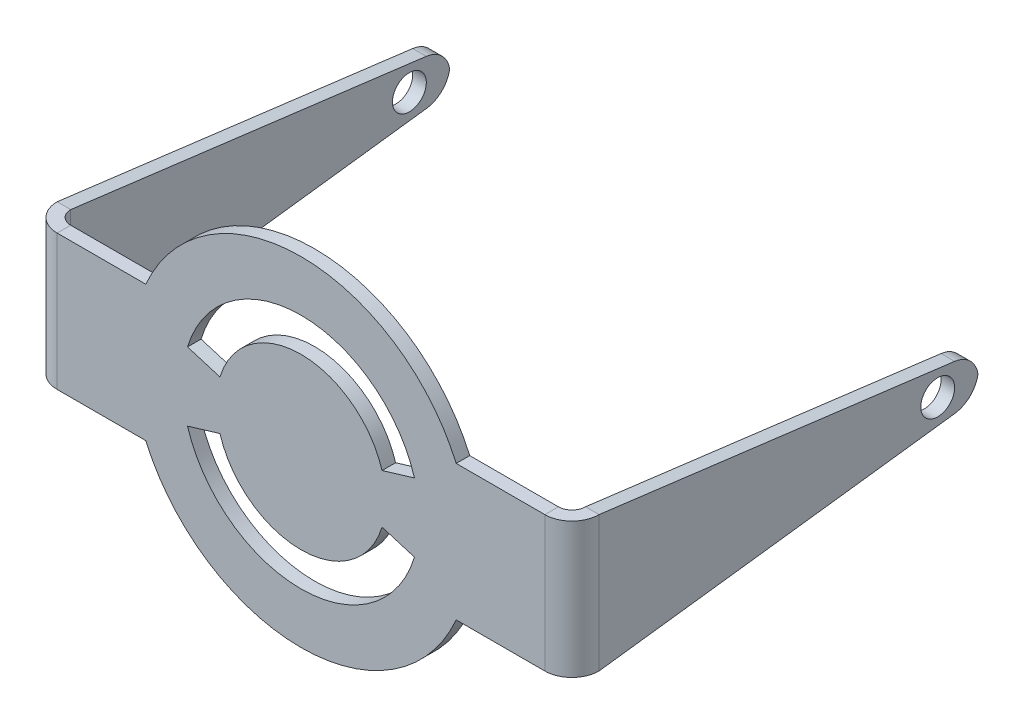
ISO-10303-21;
HEADER;
FILE_DESCRIPTION(('STEP AP214'),'2;1');
FILE_NAME('part.step','',(''),(''),'','','');
FILE_SCHEMA(('AUTOMOTIVE_DESIGN { 1 0 10303 214 1 1 1 1 }'));
ENDSEC;
DATA;
#1=APPLICATION_CONTEXT('core data for automotive mechanical design processes');
#2=APPLICATION_PROTOCOL_DEFINITION('international standard','automotive_design',2000,#1);
#3=PRODUCT_CONTEXT('',#1,'mechanical');
#4=PRODUCT('Part','Part','',(#3));
#5=PRODUCT_RELATED_PRODUCT_CATEGORY('part','',(#4));
#6=PRODUCT_DEFINITION_FORMATION('','',#4);
#7=PRODUCT_DEFINITION_CONTEXT('part definition',#1,'design');
#8=PRODUCT_DEFINITION('design','',#6,#7);
#9=PRODUCT_DEFINITION_SHAPE('','',#8);
#10=(LENGTH_UNIT() NAMED_UNIT(*) SI_UNIT(.MILLI.,.METRE.));
#11=(NAMED_UNIT(*) PLANE_ANGLE_UNIT() SI_UNIT($,.RADIAN.));
#12=(NAMED_UNIT(*) SI_UNIT($,.STERADIAN.) SOLID_ANGLE_UNIT());
#13=UNCERTAINTY_MEASURE_WITH_UNIT(LENGTH_MEASURE(1.E-05),#10,'distance_accuracy_value','');
#14=(GEOMETRIC_REPRESENTATION_CONTEXT(3) GLOBAL_UNCERTAINTY_ASSIGNED_CONTEXT((#13)) GLOBAL_UNIT_ASSIGNED_CONTEXT((#10,
#11,#12)) REPRESENTATION_CONTEXT('',''));
#15=CARTESIAN_POINT('',(0.,0.,0.));
#16=DIRECTION('',(0.,0.,1.));
#17=DIRECTION('',(1.,0.,0.));
#18=AXIS2_PLACEMENT_3D('',#15,#16,#17);
#19=CARTESIAN_POINT('',(-23.1327789593846,25.,9.23646929673279));
#20=DIRECTION('',(0.,0.,1.));
#21=DIRECTION('',(1.,0.,0.));
#22=AXIS2_PLACEMENT_3D('',#19,#20,#21);
#23=PLANE('',#22);
#24=DIRECTION('',(-0.957234693978064,-0.289312531088306,0.));
#25=VECTOR('',#24,1.);
#26=CARTESIAN_POINT('',(-3.72396895395982,12.321320022393,9.23646929673279));
#27=LINE('',#26,#25);
#28=CARTESIAN_POINT('',(-9.11549579674755,10.6917966806981,9.23646929673279));
#29=VERTEX_POINT('',#28);
#30=CARTESIAN_POINT('',(-11.5085825316927,9.96851535297733,9.23646929673279));
#31=VERTEX_POINT('',#30);
#32=EDGE_CURVE('E113',#29,#31,#27,.T.);
#33=ORIENTED_EDGE('',*,*,#32,.F.);
#34=CARTESIAN_POINT('',(-3.13277895938465,12.5,9.23646929673279));
#35=DIRECTION('',(0.,0.,1.));
#36=DIRECTION('',(1.,0.,0.));
#37=AXIS2_PLACEMENT_3D('',#34,#35,#36);
#38=CIRCLE('',#37,6.25);
#39=CARTESIAN_POINT('',(2.84993787797825,10.6917966806981,9.23646929673279));
#40=VERTEX_POINT('',#39);
#41=EDGE_CURVE('E311',#29,#40,#38,.T.);
#42=ORIENTED_EDGE('',*,*,#41,.T.);
#43=DIRECTION('',(0.957234693978064,-0.289312531088305,0.));
#44=VECTOR('',#43,1.);
#45=CARTESIAN_POINT('',(3.19953085004851,10.5861364614889,9.23646929673279));
#46=LINE('',#45,#44);
#47=CARTESIAN_POINT('',(5.24302461292342,9.96851535297733,9.23646929673279));
#48=VERTEX_POINT('',#47);
#49=EDGE_CURVE('E307',#40,#48,#46,.T.);
#50=ORIENTED_EDGE('',*,*,#49,.T.);
#51=CARTESIAN_POINT('',(-3.13277895938465,12.5,9.23646929673279));
#52=DIRECTION('',(0.,0.,1.));
#53=DIRECTION('',(1.,0.,0.));
#54=AXIS2_PLACEMENT_3D('',#51,#52,#53);
#55=CIRCLE('',#54,8.75);
#56=EDGE_CURVE('E303',#31,#48,#55,.T.);
#57=ORIENTED_EDGE('',*,*,#56,.F.);
#58=EDGE_LOOP('',(#33,#42,#50,#57));
#59=FACE_BOUND('',#58,.T.);
#60=DIRECTION('',(1.,0.,0.));
#61=VECTOR('',#60,1.);
#62=CARTESIAN_POINT('',(0.,17.5,9.23646929673279));
#63=LINE('',#62,#61);
#64=CARTESIAN_POINT('',(8.32366027800496,17.5,9.23646929673279));
#65=VERTEX_POINT('',#64);
#66=CARTESIAN_POINT('',(14.8672210406154,17.5,9.23646929673279));
#67=VERTEX_POINT('',#66);
#68=EDGE_CURVE('E373',#65,#67,#63,.T.);
#69=ORIENTED_EDGE('',*,*,#68,.F.);
#70=CARTESIAN_POINT('',(-3.13277895938465,12.5,9.23646929673279));
#71=DIRECTION('',(0.,0.,1.));
#72=DIRECTION('',(1.,0.,0.));
#73=AXIS2_PLACEMENT_3D('',#70,#71,#72);
#74=CIRCLE('',#73,12.5);
#75=CARTESIAN_POINT('',(-14.5892181967743,17.5,9.23646929673279));
#76=VERTEX_POINT('',#75);
#77=EDGE_CURVE('E410',#65,#76,#74,.T.);
#78=ORIENTED_EDGE('',*,*,#77,.T.);
#79=DIRECTION('',(1.,0.,0.));
#80=VECTOR('',#79,1.);
#81=CARTESIAN_POINT('',(0.,17.5,9.23646929673279));
#82=LINE('',#81,#80);
#83=CARTESIAN_POINT('',(-21.1327789593846,17.5,9.23646929673279));
#84=VERTEX_POINT('',#83);
#85=EDGE_CURVE('E405',#84,#76,#82,.T.);
#86=ORIENTED_EDGE('',*,*,#85,.F.);
#87=DIRECTION('',(0.,-1.,0.));
#88=VECTOR('',#87,1.);
#89=CARTESIAN_POINT('',(-21.1327789593846,25.,9.23646929673279));
#90=LINE('',#89,#88);
#91=CARTESIAN_POINT('',(-21.1327789593846,7.5,9.23646929673279));
#92=VERTEX_POINT('',#91);
#93=EDGE_CURVE('E464',#84,#92,#90,.T.);
#94=ORIENTED_EDGE('',*,*,#93,.T.);
#95=DIRECTION('',(1.,0.,0.));
#96=VECTOR('',#95,1.);
#97=CARTESIAN_POINT('',(0.,7.5,9.23646929673279));
#98=LINE('',#97,#96);
#99=CARTESIAN_POINT('',(-14.5892181967743,7.5,9.23646929673279));
#100=VERTEX_POINT('',#99);
#101=EDGE_CURVE('E409',#92,#100,#98,.T.);
#102=ORIENTED_EDGE('',*,*,#101,.T.);
#103=CARTESIAN_POINT('',(-3.13277895938465,12.5,9.23646929673279));
#104=DIRECTION('',(0.,0.,1.));
#105=DIRECTION('',(1.,0.,0.));
#106=AXIS2_PLACEMENT_3D('',#103,#104,#105);
#107=CIRCLE('',#106,12.5);
#108=CARTESIAN_POINT('',(8.32366027800496,7.5,9.23646929673279));
#109=VERTEX_POINT('',#108);
#110=EDGE_CURVE('E421',#100,#109,#107,.T.);
#111=ORIENTED_EDGE('',*,*,#110,.T.);
#112=DIRECTION('',(1.,0.,0.));
#113=VECTOR('',#112,1.);
#114=CARTESIAN_POINT('',(0.,7.5,9.23646929673279));
#115=LINE('',#114,#113);
#116=CARTESIAN_POINT('',(14.8672210406154,7.5,9.23646929673279));
#117=VERTEX_POINT('',#116);
#118=EDGE_CURVE('E378',#109,#117,#115,.T.);
#119=ORIENTED_EDGE('',*,*,#118,.T.);
#120=DIRECTION('',(0.,-1.,0.));
#121=VECTOR('',#120,1.);
#122=CARTESIAN_POINT('',(14.8672210406154,25.,9.23646929673279));
#123=LINE('',#122,#121);
#124=EDGE_CURVE('E460',#67,#117,#123,.T.);
#125=ORIENTED_EDGE('',*,*,#124,.F.);
#126=EDGE_LOOP('',(#69,#78,#86,#94,#102,#111,#119,#125));
#127=FACE_BOUND('',#126,.T.);
#128=DIRECTION('',(0.957234693978064,0.289312531088305,0.));
#129=VECTOR('',#128,1.);
#130=CARTESIAN_POINT('',(-3.72396895395982,12.321320022393,9.23646929673279));
#131=LINE('',#130,#129);
#132=CARTESIAN_POINT('',(2.84993787797825,14.3082033193019,9.23646929673279));
#133=VERTEX_POINT('',#132);
#134=CARTESIAN_POINT('',(5.24302461292342,15.0314846470227,9.23646929673279));
#135=VERTEX_POINT('',#134);
#136=EDGE_CURVE('E280',#133,#135,#131,.T.);
#137=ORIENTED_EDGE('',*,*,#136,.F.);
#138=CARTESIAN_POINT('',(-3.13277895938465,12.5,9.23646929673279));
#139=DIRECTION('',(0.,0.,1.));
#140=DIRECTION('',(1.,0.,0.));
#141=AXIS2_PLACEMENT_3D('',#138,#139,#140);
#142=CIRCLE('',#141,6.25);
#143=CARTESIAN_POINT('',(-9.11549579674755,14.3082033193019,9.23646929673279));
#144=VERTEX_POINT('',#143);
#145=EDGE_CURVE('E105',#133,#144,#142,.T.);
#146=ORIENTED_EDGE('',*,*,#145,.T.);
#147=DIRECTION('',(-0.957234693978064,0.289312531088305,0.));
#148=VECTOR('',#147,1.);
#149=CARTESIAN_POINT('',(3.19953085004851,10.5861364614889,9.23646929673279));
#150=LINE('',#149,#148);
#151=CARTESIAN_POINT('',(-11.5085825316927,15.0314846470227,9.23646929673279));
#152=VERTEX_POINT('',#151);
#153=EDGE_CURVE('E286',#144,#152,#150,.T.);
#154=ORIENTED_EDGE('',*,*,#153,.T.);
#155=CARTESIAN_POINT('',(-3.13277895938465,12.5,9.23646929673279));
#156=DIRECTION('',(0.,0.,1.));
#157=DIRECTION('',(1.,0.,0.));
#158=AXIS2_PLACEMENT_3D('',#155,#156,#157);
#159=CIRCLE('',#158,8.75);
#160=EDGE_CURVE('E269',#135,#152,#159,.T.);
#161=ORIENTED_EDGE('',*,*,#160,.F.);
#162=EDGE_LOOP('',(#137,#146,#154,#161));
#163=FACE_BOUND('',#162,.T.);
#164=ADVANCED_FACE('F89',(#59,#127,#163),#23,.T.);
#165=CARTESIAN_POINT('',(-23.1327789593846,25.,8.23646929673279));
#166=DIRECTION('',(0.,0.,1.));
#167=DIRECTION('',(1.,0.,0.));
#168=AXIS2_PLACEMENT_3D('',#165,#166,#167);
#169=PLANE('',#168);
#170=CARTESIAN_POINT('',(-3.13277895938465,12.5,8.23646929673279));
#171=DIRECTION('',(0.,0.,1.));
#172=DIRECTION('',(1.,0.,0.));
#173=AXIS2_PLACEMENT_3D('',#170,#171,#172);
#174=CIRCLE('',#173,12.5);
#175=CARTESIAN_POINT('',(8.32366027800496,17.5,8.23646929673278));
#176=VERTEX_POINT('',#175);
#177=CARTESIAN_POINT('',(-14.5892181967743,17.5,8.23646929673278));
#178=VERTEX_POINT('',#177);
#179=EDGE_CURVE('E483',#176,#178,#174,.T.);
#180=ORIENTED_EDGE('',*,*,#179,.F.);
#181=DIRECTION('',(1.,0.,0.));
#182=VECTOR('',#181,1.);
#183=CARTESIAN_POINT('',(-23.1327789593846,17.5,8.23646929673279));
#184=LINE('',#183,#182);
#185=CARTESIAN_POINT('',(14.8672210406154,17.5,8.23646929673279));
#186=VERTEX_POINT('',#185);
#187=EDGE_CURVE('E396',#176,#186,#184,.T.);
#188=ORIENTED_EDGE('',*,*,#187,.T.);
#189=DIRECTION('',(0.,-1.,0.));
#190=VECTOR('',#189,1.);
#191=CARTESIAN_POINT('',(14.8672210406154,25.,8.23646929673279));
#192=LINE('',#191,#190);
#193=CARTESIAN_POINT('',(14.8672210406154,7.5,8.23646929673279));
#194=VERTEX_POINT('',#193);
#195=EDGE_CURVE('E448',#186,#194,#192,.T.);
#196=ORIENTED_EDGE('',*,*,#195,.T.);
#197=DIRECTION('',(1.,0.,0.));
#198=VECTOR('',#197,1.);
#199=CARTESIAN_POINT('',(-23.1327789593846,7.5,8.23646929673279));
#200=LINE('',#199,#198);
#201=CARTESIAN_POINT('',(8.32366027800496,7.5,8.23646929673278));
#202=VERTEX_POINT('',#201);
#203=EDGE_CURVE('E382',#202,#194,#200,.T.);
#204=ORIENTED_EDGE('',*,*,#203,.F.);
#205=CARTESIAN_POINT('',(-3.13277895938465,12.5,8.23646929673279));
#206=DIRECTION('',(0.,0.,1.));
#207=DIRECTION('',(1.,0.,0.));
#208=AXIS2_PLACEMENT_3D('',#205,#206,#207);
#209=CIRCLE('',#208,12.5);
#210=CARTESIAN_POINT('',(-14.5892181967743,7.5,8.23646929673278));
#211=VERTEX_POINT('',#210);
#212=EDGE_CURVE('E480',#211,#202,#209,.T.);
#213=ORIENTED_EDGE('',*,*,#212,.F.);
#214=DIRECTION('',(1.,0.,0.));
#215=VECTOR('',#214,1.);
#216=CARTESIAN_POINT('',(-23.1327789593846,7.5,8.23646929673279));
#217=LINE('',#216,#215);
#218=CARTESIAN_POINT('',(-21.1327789593846,7.5,8.23646929673279));
#219=VERTEX_POINT('',#218);
#220=EDGE_CURVE('E414',#219,#211,#217,.T.);
#221=ORIENTED_EDGE('',*,*,#220,.F.);
#222=DIRECTION('',(0.,-1.,0.));
#223=VECTOR('',#222,1.);
#224=CARTESIAN_POINT('',(-21.1327789593846,25.,8.23646929673279));
#225=LINE('',#224,#223);
#226=CARTESIAN_POINT('',(-21.1327789593846,17.5,8.23646929673279));
#227=VERTEX_POINT('',#226);
#228=EDGE_CURVE('E444',#227,#219,#225,.T.);
#229=ORIENTED_EDGE('',*,*,#228,.F.);
#230=DIRECTION('',(1.,0.,0.));
#231=VECTOR('',#230,1.);
#232=CARTESIAN_POINT('',(-23.1327789593846,17.5,8.23646929673279));
#233=LINE('',#232,#231);
#234=EDGE_CURVE('E432',#227,#178,#233,.T.);
#235=ORIENTED_EDGE('',*,*,#234,.T.);
#236=EDGE_LOOP('',(#180,#188,#196,#204,#213,#221,#229,#235));
#237=FACE_BOUND('',#236,.T.);
#238=CARTESIAN_POINT('',(-3.13277895938465,12.5,8.23646929673279));
#239=DIRECTION('',(0.,0.,1.));
#240=DIRECTION('',(1.,0.,0.));
#241=AXIS2_PLACEMENT_3D('',#238,#239,#240);
#242=CIRCLE('',#241,6.25);
#243=CARTESIAN_POINT('',(-9.11549579674755,10.6917966806981,8.23646929673279));
#244=VERTEX_POINT('',#243);
#245=CARTESIAN_POINT('',(2.84993787797825,10.6917966806981,8.23646929673279));
#246=VERTEX_POINT('',#245);
#247=EDGE_CURVE('E573',#244,#246,#242,.T.);
#248=ORIENTED_EDGE('',*,*,#247,.F.);
#249=DIRECTION('',(-0.957234693978064,-0.289312531088306,0.));
#250=VECTOR('',#249,1.);
#251=CARTESIAN_POINT('',(-17.9969942444861,8.00747191485236,8.23646929673279));
#252=LINE('',#251,#250);
#253=CARTESIAN_POINT('',(-11.5085825316927,9.96851535297733,8.23646929673279));
#254=VERTEX_POINT('',#253);
#255=EDGE_CURVE('E576',#244,#254,#252,.T.);
#256=ORIENTED_EDGE('',*,*,#255,.T.);
#257=CARTESIAN_POINT('',(-3.13277895938465,12.5,8.23646929673279));
#258=DIRECTION('',(0.,0.,1.));
#259=DIRECTION('',(1.,0.,0.));
#260=AXIS2_PLACEMENT_3D('',#257,#258,#259);
#261=CIRCLE('',#260,8.75);
#262=CARTESIAN_POINT('',(5.24302461292342,9.96851535297733,8.23646929673279));
#263=VERTEX_POINT('',#262);
#264=EDGE_CURVE('E559',#254,#263,#261,.T.);
#265=ORIENTED_EDGE('',*,*,#264,.T.);
#266=DIRECTION('',(0.957234693978064,-0.289312531088305,0.));
#267=VECTOR('',#266,1.);
#268=CARTESIAN_POINT('',(-24.9204940484944,19.0850716012657,8.23646929673279));
#269=LINE('',#268,#267);
#270=EDGE_CURVE('E569',#246,#263,#269,.T.);
#271=ORIENTED_EDGE('',*,*,#270,.F.);
#272=EDGE_LOOP('',(#248,#256,#265,#271));
#273=FACE_BOUND('',#272,.T.);
#274=CARTESIAN_POINT('',(-3.13277895938465,12.5,8.23646929673279));
#275=DIRECTION('',(0.,0.,1.));
#276=DIRECTION('',(1.,0.,0.));
#277=AXIS2_PLACEMENT_3D('',#274,#275,#276);
#278=CIRCLE('',#277,6.25);
#279=CARTESIAN_POINT('',(2.84993787797826,14.3082033193019,8.23646929673279));
#280=VERTEX_POINT('',#279);
#281=CARTESIAN_POINT('',(-9.11549579674755,14.3082033193019,8.23646929673279));
#282=VERTEX_POINT('',#281);
#283=EDGE_CURVE('E12',#280,#282,#278,.T.);
#284=ORIENTED_EDGE('',*,*,#283,.F.);
#285=DIRECTION('',(0.957234693978064,0.289312531088305,0.));
#286=VECTOR('',#285,1.);
#287=CARTESIAN_POINT('',(-17.9969942444861,8.00747191485236,8.23646929673279));
#288=LINE('',#287,#286);
#289=CARTESIAN_POINT('',(5.24302461292342,15.0314846470227,8.23646929673279));
#290=VERTEX_POINT('',#289);
#291=EDGE_CURVE('E580',#280,#290,#288,.T.);
#292=ORIENTED_EDGE('',*,*,#291,.T.);
#293=CARTESIAN_POINT('',(-3.13277895938465,12.5,8.23646929673279));
#294=DIRECTION('',(0.,0.,1.));
#295=DIRECTION('',(1.,0.,0.));
#296=AXIS2_PLACEMENT_3D('',#293,#294,#295);
#297=CIRCLE('',#296,8.75);
#298=CARTESIAN_POINT('',(-11.5085825316927,15.0314846470227,8.23646929673279));
#299=VERTEX_POINT('',#298);
#300=EDGE_CURVE('E272',#290,#299,#297,.T.);
#301=ORIENTED_EDGE('',*,*,#300,.T.);
#302=DIRECTION('',(-0.957234693978064,0.289312531088305,0.));
#303=VECTOR('',#302,1.);
#304=CARTESIAN_POINT('',(-24.9204940484944,19.0850716012657,8.23646929673279));
#305=LINE('',#304,#303);
#306=EDGE_CURVE('E98',#282,#299,#305,.T.);
#307=ORIENTED_EDGE('',*,*,#306,.F.);
#308=EDGE_LOOP('',(#284,#292,#301,#307));
#309=FACE_BOUND('',#308,.T.);
#310=ADVANCED_FACE('F591',(#237,#273,#309),#169,.F.);
#311=CARTESIAN_POINT('',(0.,7.5,-42.123540066561));
#312=DIRECTION('',(0.,-1.,0.));
#313=DIRECTION('',(0.,0.,-1.));
#314=AXIS2_PLACEMENT_3D('',#311,#312,#313);
#315=PLANE('',#314);
#316=ORIENTED_EDGE('',*,*,#203,.T.);
#317=DIRECTION('',(0.,0.,1.));
#318=VECTOR('',#317,1.);
#319=CARTESIAN_POINT('',(14.8672210406154,7.5,8.23646929673279));
#320=LINE('',#319,#318);
#321=EDGE_CURVE('E514',#194,#117,#320,.T.);
#322=ORIENTED_EDGE('',*,*,#321,.T.);
#323=ORIENTED_EDGE('',*,*,#118,.F.);
#324=DIRECTION('',(0.,0.,1.));
#325=VECTOR('',#324,1.);
#326=CARTESIAN_POINT('',(8.32366027800496,7.5,-42.123540066561));
#327=LINE('',#326,#325);
#328=EDGE_CURVE('E372',#202,#109,#327,.T.);
#329=ORIENTED_EDGE('',*,*,#328,.F.);
#330=EDGE_LOOP('',(#316,#322,#323,#329));
#331=FACE_BOUND('',#330,.T.);
#332=ADVANCED_FACE('F613',(#331),#315,.T.);
#333=CARTESIAN_POINT('',(0.,17.5,-42.123540066561));
#334=DIRECTION('',(0.,-1.,0.));
#335=DIRECTION('',(0.,0.,-1.));
#336=AXIS2_PLACEMENT_3D('',#333,#334,#335);
#337=PLANE('',#336);
#338=ORIENTED_EDGE('',*,*,#68,.T.);
#339=DIRECTION('',(0.,0.,-1.));
#340=VECTOR('',#339,1.);
#341=CARTESIAN_POINT('',(14.8672210406154,17.5,9.23646929673279));
#342=LINE('',#341,#340);
#343=EDGE_CURVE('E508',#67,#186,#342,.T.);
#344=ORIENTED_EDGE('',*,*,#343,.T.);
#345=ORIENTED_EDGE('',*,*,#187,.F.);
#346=DIRECTION('',(0.,0.,1.));
#347=VECTOR('',#346,1.);
#348=CARTESIAN_POINT('',(8.32366027800496,17.5,-42.123540066561));
#349=LINE('',#348,#347);
#350=EDGE_CURVE('E377',#176,#65,#349,.T.);
#351=ORIENTED_EDGE('',*,*,#350,.T.);
#352=EDGE_LOOP('',(#338,#344,#345,#351));
#353=FACE_BOUND('',#352,.T.);
#354=ADVANCED_FACE('F700',(#353),#337,.F.);
#355=CARTESIAN_POINT('',(0.,17.5,-42.123540066561));
#356=DIRECTION('',(0.,-1.,0.));
#357=DIRECTION('',(0.,0.,-1.));
#358=AXIS2_PLACEMENT_3D('',#355,#356,#357);
#359=PLANE('',#358);
#360=ORIENTED_EDGE('',*,*,#234,.F.);
#361=DIRECTION('',(0.,0.,1.));
#362=VECTOR('',#361,1.);
#363=CARTESIAN_POINT('',(-21.1327789593846,17.5,8.23646929673279));
#364=LINE('',#363,#362);
#365=EDGE_CURVE('E505',#227,#84,#364,.T.);
#366=ORIENTED_EDGE('',*,*,#365,.T.);
#367=ORIENTED_EDGE('',*,*,#85,.T.);
#368=DIRECTION('',(0.,0.,1.));
#369=VECTOR('',#368,1.);
#370=CARTESIAN_POINT('',(-14.5892181967743,17.5,-42.123540066561));
#371=LINE('',#370,#369);
#372=EDGE_CURVE('E408',#178,#76,#371,.T.);
#373=ORIENTED_EDGE('',*,*,#372,.F.);
#374=EDGE_LOOP('',(#360,#366,#367,#373));
#375=FACE_BOUND('',#374,.T.);
#376=ADVANCED_FACE('F742',(#375),#359,.F.);
#377=CARTESIAN_POINT('',(0.,7.5,-42.123540066561));
#378=DIRECTION('',(0.,-1.,0.));
#379=DIRECTION('',(0.,0.,-1.));
#380=AXIS2_PLACEMENT_3D('',#377,#378,#379);
#381=PLANE('',#380);
#382=ORIENTED_EDGE('',*,*,#101,.F.);
#383=DIRECTION('',(0.,0.,-1.));
#384=VECTOR('',#383,1.);
#385=CARTESIAN_POINT('',(-21.1327789593846,7.5,9.23646929673279));
#386=LINE('',#385,#384);
#387=EDGE_CURVE('E498',#92,#219,#386,.T.);
#388=ORIENTED_EDGE('',*,*,#387,.T.);
#389=ORIENTED_EDGE('',*,*,#220,.T.);
#390=DIRECTION('',(0.,0.,1.));
#391=VECTOR('',#390,1.);
#392=CARTESIAN_POINT('',(-14.5892181967743,7.5,-42.123540066561));
#393=LINE('',#392,#391);
#394=EDGE_CURVE('E404',#211,#100,#393,.T.);
#395=ORIENTED_EDGE('',*,*,#394,.T.);
#396=EDGE_LOOP('',(#382,#388,#389,#395));
#397=FACE_BOUND('',#396,.T.);
#398=ADVANCED_FACE('F716',(#397),#381,.T.);
#399=CARTESIAN_POINT('',(14.8672210406154,25.,7.2364692967328));
#400=DIRECTION('',(0.,-1.,0.));
#401=DIRECTION('',(0.,0.,-1.));
#402=AXIS2_PLACEMENT_3D('',#399,#400,#401);
#403=CYLINDRICAL_SURFACE('',#402,2.);
#404=CARTESIAN_POINT('',(14.8672210406154,17.5,7.2364692967328));
#405=DIRECTION('',(0.,-1.,0.));
#406=DIRECTION('',(0.,0.,-1.));
#407=AXIS2_PLACEMENT_3D('',#404,#405,#406);
#408=CIRCLE('',#407,2.);
#409=CARTESIAN_POINT('',(16.8672210406154,17.5,7.2364692967328));
#410=VERTEX_POINT('',#409);
#411=EDGE_CURVE('E400',#67,#410,#408,.F.);
#412=ORIENTED_EDGE('',*,*,#411,.F.);
#413=ORIENTED_EDGE('',*,*,#124,.T.);
#414=CARTESIAN_POINT('',(14.8672210406154,7.5,7.2364692967328));
#415=DIRECTION('',(0.,-1.,0.));
#416=DIRECTION('',(0.,0.,-1.));
#417=AXIS2_PLACEMENT_3D('',#414,#415,#416);
#418=CIRCLE('',#417,2.);
#419=CARTESIAN_POINT('',(16.8672210406154,7.5,7.23646929673278));
#420=VERTEX_POINT('',#419);
#421=EDGE_CURVE('E392',#117,#420,#418,.F.);
#422=ORIENTED_EDGE('',*,*,#421,.T.);
#423=DIRECTION('',(0.,-1.,0.));
#424=VECTOR('',#423,1.);
#425=CARTESIAN_POINT('',(16.8672210406154,25.,7.2364692967328));
#426=LINE('',#425,#424);
#427=EDGE_CURVE('E456',#410,#420,#426,.T.);
#428=ORIENTED_EDGE('',*,*,#427,.F.);
#429=EDGE_LOOP('',(#412,#413,#422,#428));
#430=FACE_BOUND('',#429,.T.);
#431=ADVANCED_FACE('F619',(#430),#403,.T.);
#432=CARTESIAN_POINT('',(16.8672210406154,25.,9.23646929673279));
#433=DIRECTION('',(1.,0.,0.));
#434=DIRECTION('',(0.,0.,-1.));
#435=AXIS2_PLACEMENT_3D('',#432,#433,#434);
#436=PLANE('',#435);
#437=DIRECTION('',(0.,-0.125824098850382,0.992052567230431));
#438=VECTOR('',#437,1.);
#439=CARTESIAN_POINT('',(16.8672210406154,8.28454813504035,1.05074654096625));
#440=LINE('',#439,#438);
#441=CARTESIAN_POINT('',(16.8672210406154,10.8295513634266,-19.015178900968));
#442=VERTEX_POINT('',#441);
#443=EDGE_CURVE('E337',#442,#420,#440,.T.);
#444=ORIENTED_EDGE('',*,*,#443,.F.);
#445=CARTESIAN_POINT('',(16.8672210406154,12.8136564978875,-18.7635307032672));
#446=DIRECTION('',(1.,0.,0.));
#447=DIRECTION('',(0.,0.,-1.));
#448=AXIS2_PLACEMENT_3D('',#445,#446,#447);
#449=CIRCLE('',#448,2.);
#450=CARTESIAN_POINT('',(16.8672210406154,12.5006086967021,-20.7388790457559));
#451=VERTEX_POINT('',#450);
#452=EDGE_CURVE('E547',#442,#451,#449,.T.);
#453=ORIENTED_EDGE('',*,*,#452,.T.);
#454=CARTESIAN_POINT('',(16.8672210406154,12.1875608955167,-18.7635307032672));
#455=DIRECTION('',(1.,0.,0.));
#456=DIRECTION('',(0.,0.,-1.));
#457=AXIS2_PLACEMENT_3D('',#454,#455,#456);
#458=CIRCLE('',#457,2.);
#459=CARTESIAN_POINT('',(16.8672210406154,14.1716775131709,-19.0150883458627));
#460=VERTEX_POINT('',#459);
#461=EDGE_CURVE('E544',#451,#460,#458,.T.);
#462=ORIENTED_EDGE('',*,*,#461,.T.);
#463=DIRECTION('',(0.,-0.125778821297726,-0.992058308827135));
#464=VECTOR('',#463,1.);
#465=CARTESIAN_POINT('',(16.8672210406154,16.3201784477261,-2.06916548176528));
#466=LINE('',#465,#464);
#467=EDGE_CURVE('E327',#410,#460,#466,.T.);
#468=ORIENTED_EDGE('',*,*,#467,.F.);
#469=ORIENTED_EDGE('',*,*,#427,.T.);
#470=EDGE_LOOP('',(#444,#453,#462,#468,#469));
#471=FACE_BOUND('',#470,.T.);
#472=CARTESIAN_POINT('',(16.8672210406154,12.5,-17.7635307032672));
#473=DIRECTION('',(1.,0.,0.));
#474=DIRECTION('',(0.,0.,-1.));
#475=AXIS2_PLACEMENT_3D('',#472,#473,#474);
#476=CIRCLE('',#475,1.25);
#477=CARTESIAN_POINT('',(16.8672210406154,12.5,-19.0135307032672));
#478=VERTEX_POINT('',#477);
#479=EDGE_CURVE('E343',#478,#478,#476,.T.);
#480=ORIENTED_EDGE('',*,*,#479,.F.);
#481=EDGE_LOOP('',(#480));
#482=FACE_BOUND('',#481,.T.);
#483=ADVANCED_FACE('F679',(#471,#482),#436,.T.);
#484=CARTESIAN_POINT('',(15.8672210406154,25.,9.23646929673279));
#485=DIRECTION('',(1.,0.,0.));
#486=DIRECTION('',(0.,0.,-1.));
#487=AXIS2_PLACEMENT_3D('',#484,#485,#486);
#488=PLANE('',#487);
#489=CARTESIAN_POINT('',(15.8672210406154,12.5,-17.7635307032672));
#490=DIRECTION('',(1.,0.,0.));
#491=DIRECTION('',(0.,0.,-1.));
#492=AXIS2_PLACEMENT_3D('',#489,#490,#491);
#493=CIRCLE('',#492,1.25);
#494=CARTESIAN_POINT('',(15.8672210406154,12.5,-19.0135307032672));
#495=VERTEX_POINT('',#494);
#496=EDGE_CURVE('E368',#495,#495,#493,.T.);
#497=ORIENTED_EDGE('',*,*,#496,.T.);
#498=EDGE_LOOP('',(#497));
#499=FACE_BOUND('',#498,.T.);
#500=CARTESIAN_POINT('',(15.8672210406154,12.1875608955167,-18.7635307032672));
#501=DIRECTION('',(1.,0.,0.));
#502=DIRECTION('',(0.,0.,-1.));
#503=AXIS2_PLACEMENT_3D('',#500,#501,#502);
#504=CIRCLE('',#503,2.);
#505=CARTESIAN_POINT('',(15.8672210406154,14.1716775131709,-19.0150883458627));
#506=VERTEX_POINT('',#505);
#507=CARTESIAN_POINT('',(15.8672210406154,12.5006086967021,-20.7388790457559));
#508=VERTEX_POINT('',#507);
#509=EDGE_CURVE('E550',#506,#508,#504,.F.);
#510=ORIENTED_EDGE('',*,*,#509,.T.);
#511=CARTESIAN_POINT('',(15.8672210406154,12.8136564978875,-18.7635307032672));
#512=DIRECTION('',(1.,0.,0.));
#513=DIRECTION('',(0.,0.,-1.));
#514=AXIS2_PLACEMENT_3D('',#511,#512,#513);
#515=CIRCLE('',#514,2.);
#516=CARTESIAN_POINT('',(15.8672210406154,10.8295513634266,-19.015178900968));
#517=VERTEX_POINT('',#516);
#518=EDGE_CURVE('E553',#508,#517,#515,.F.);
#519=ORIENTED_EDGE('',*,*,#518,.T.);
#520=DIRECTION('',(0.,-0.125824098850382,0.992052567230431));
#521=VECTOR('',#520,1.);
#522=CARTESIAN_POINT('',(15.8672210406154,7.52740657683348,7.02038378406017));
#523=LINE('',#522,#521);
#524=CARTESIAN_POINT('',(15.8672210406154,7.5,7.23646929673277));
#525=VERTEX_POINT('',#524);
#526=EDGE_CURVE('E354',#517,#525,#523,.T.);
#527=ORIENTED_EDGE('',*,*,#526,.T.);
#528=DIRECTION('',(0.,-1.,0.));
#529=VECTOR('',#528,1.);
#530=CARTESIAN_POINT('',(15.8672210406154,25.,7.2364692967328));
#531=LINE('',#530,#529);
#532=CARTESIAN_POINT('',(15.8672210406154,17.5,7.2364692967328));
#533=VERTEX_POINT('',#532);
#534=EDGE_CURVE('E452',#533,#525,#531,.T.);
#535=ORIENTED_EDGE('',*,*,#534,.F.);
#536=DIRECTION('',(0.,-0.125778821297726,-0.992058308827135));
#537=VECTOR('',#536,1.);
#538=CARTESIAN_POINT('',(15.8672210406154,17.8682121886386,10.1406781085304));
#539=LINE('',#538,#537);
#540=EDGE_CURVE('E360',#533,#506,#539,.T.);
#541=ORIENTED_EDGE('',*,*,#540,.T.);
#542=EDGE_LOOP('',(#510,#519,#527,#535,#541));
#543=FACE_BOUND('',#542,.T.);
#544=ADVANCED_FACE('F659',(#499,#543),#488,.F.);
#545=CARTESIAN_POINT('',(14.8672210406154,25.,7.2364692967328));
#546=DIRECTION('',(0.,-1.,0.));
#547=DIRECTION('',(0.,0.,-1.));
#548=AXIS2_PLACEMENT_3D('',#545,#546,#547);
#549=CYLINDRICAL_SURFACE('',#548,1.);
#550=ORIENTED_EDGE('',*,*,#195,.F.);
#551=CARTESIAN_POINT('',(14.8672210406154,17.5,7.2364692967328));
#552=DIRECTION('',(0.,-1.,0.));
#553=DIRECTION('',(0.,0.,-1.));
#554=AXIS2_PLACEMENT_3D('',#551,#552,#553);
#555=CIRCLE('',#554,1.);
#556=EDGE_CURVE('E490',#186,#533,#555,.F.);
#557=ORIENTED_EDGE('',*,*,#556,.T.);
#558=ORIENTED_EDGE('',*,*,#534,.T.);
#559=CARTESIAN_POINT('',(14.8672210406154,7.5,7.2364692967328));
#560=DIRECTION('',(0.,-1.,0.));
#561=DIRECTION('',(0.,0.,-1.));
#562=AXIS2_PLACEMENT_3D('',#559,#560,#561);
#563=CIRCLE('',#562,1.);
#564=EDGE_CURVE('E486',#194,#525,#563,.F.);
#565=ORIENTED_EDGE('',*,*,#564,.F.);
#566=EDGE_LOOP('',(#550,#557,#558,#565));
#567=FACE_BOUND('',#566,.T.);
#568=ADVANCED_FACE('F633',(#567),#549,.F.);
#569=CARTESIAN_POINT('',(-22.1327789593846,25.,9.23646929673279));
#570=DIRECTION('',(-1.,0.,0.));
#571=DIRECTION('',(0.,0.,1.));
#572=AXIS2_PLACEMENT_3D('',#569,#570,#571);
#573=PLANE('',#572);
#574=CARTESIAN_POINT('',(-22.1327789593846,12.5,-17.7635307032672));
#575=DIRECTION('',(-1.,0.,0.));
#576=DIRECTION('',(0.,0.,1.));
#577=AXIS2_PLACEMENT_3D('',#574,#575,#576);
#578=CIRCLE('',#577,1.25);
#579=CARTESIAN_POINT('',(-22.1327789593846,12.5,-16.5135307032672));
#580=VERTEX_POINT('',#579);
#581=EDGE_CURVE('E364',#580,#580,#578,.T.);
#582=ORIENTED_EDGE('',*,*,#581,.T.);
#583=EDGE_LOOP('',(#582));
#584=FACE_BOUND('',#583,.T.);
#585=DIRECTION('',(0.,0.125824098850382,-0.992052567230431));
#586=VECTOR('',#585,1.);
#587=CARTESIAN_POINT('',(-22.1327789593846,7.52740657683348,7.02038378406017));
#588=LINE('',#587,#586);
#589=CARTESIAN_POINT('',(-22.1327789593846,7.5,7.2364692967328));
#590=VERTEX_POINT('',#589);
#591=CARTESIAN_POINT('',(-22.1327789593846,10.8295513634266,-19.015178900968));
#592=VERTEX_POINT('',#591);
#593=EDGE_CURVE('E336',#590,#592,#588,.T.);
#594=ORIENTED_EDGE('',*,*,#593,.T.);
#595=CARTESIAN_POINT('',(-22.1327789593846,12.8136564978875,-18.7635307032672));
#596=DIRECTION('',(-1.,0.,0.));
#597=DIRECTION('',(0.,0.,1.));
#598=AXIS2_PLACEMENT_3D('',#595,#596,#597);
#599=CIRCLE('',#598,2.);
#600=CARTESIAN_POINT('',(-22.1327789593846,12.5006086967021,-20.7388790457559));
#601=VERTEX_POINT('',#600);
#602=EDGE_CURVE('E528',#592,#601,#599,.F.);
#603=ORIENTED_EDGE('',*,*,#602,.T.);
#604=CARTESIAN_POINT('',(-22.1327789593846,12.1875608955167,-18.7635307032672));
#605=DIRECTION('',(-1.,0.,0.));
#606=DIRECTION('',(0.,0.,1.));
#607=AXIS2_PLACEMENT_3D('',#604,#605,#606);
#608=CIRCLE('',#607,2.);
#609=CARTESIAN_POINT('',(-22.1327789593846,14.1716775131709,-19.0150883458627));
#610=VERTEX_POINT('',#609);
#611=EDGE_CURVE('E525',#601,#610,#608,.F.);
#612=ORIENTED_EDGE('',*,*,#611,.T.);
#613=DIRECTION('',(0.,0.125778821297726,0.992058308827135));
#614=VECTOR('',#613,1.);
#615=CARTESIAN_POINT('',(-22.1327789593846,17.8682121886386,10.1406781085304));
#616=LINE('',#615,#614);
#617=CARTESIAN_POINT('',(-22.1327789593846,17.5,7.2364692967328));
#618=VERTEX_POINT('',#617);
#619=EDGE_CURVE('E357',#610,#618,#616,.T.);
#620=ORIENTED_EDGE('',*,*,#619,.T.);
#621=DIRECTION('',(0.,-1.,0.));
#622=VECTOR('',#621,1.);
#623=CARTESIAN_POINT('',(-22.1327789593846,25.,7.2364692967328));
#624=LINE('',#623,#622);
#625=EDGE_CURVE('E440',#618,#590,#624,.T.);
#626=ORIENTED_EDGE('',*,*,#625,.T.);
#627=EDGE_LOOP('',(#594,#603,#612,#620,#626));
#628=FACE_BOUND('',#627,.T.);
#629=ADVANCED_FACE('F629',(#584,#628),#573,.F.);
#630=CARTESIAN_POINT('',(-23.1327789593846,25.,9.23646929673279));
#631=DIRECTION('',(-1.,0.,0.));
#632=DIRECTION('',(0.,0.,1.));
#633=AXIS2_PLACEMENT_3D('',#630,#631,#632);
#634=PLANE('',#633);
#635=CARTESIAN_POINT('',(-23.1327789593846,12.1875608955167,-18.7635307032672));
#636=DIRECTION('',(-1.,0.,0.));
#637=DIRECTION('',(0.,0.,1.));
#638=AXIS2_PLACEMENT_3D('',#635,#636,#637);
#639=CIRCLE('',#638,2.);
#640=CARTESIAN_POINT('',(-23.1327789593846,14.1716775131709,-19.0150883458627));
#641=VERTEX_POINT('',#640);
#642=CARTESIAN_POINT('',(-23.1327789593846,12.5006086967021,-20.7388790457559));
#643=VERTEX_POINT('',#642);
#644=EDGE_CURVE('E531',#641,#643,#639,.T.);
#645=ORIENTED_EDGE('',*,*,#644,.T.);
#646=CARTESIAN_POINT('',(-23.1327789593846,12.8136564978875,-18.7635307032672));
#647=DIRECTION('',(-1.,0.,0.));
#648=DIRECTION('',(0.,0.,1.));
#649=AXIS2_PLACEMENT_3D('',#646,#647,#648);
#650=CIRCLE('',#649,2.);
#651=CARTESIAN_POINT('',(-23.1327789593846,10.8295513634266,-19.015178900968));
#652=VERTEX_POINT('',#651);
#653=EDGE_CURVE('E534',#643,#652,#650,.T.);
#654=ORIENTED_EDGE('',*,*,#653,.T.);
#655=DIRECTION('',(0.,-0.125824098850382,0.992052567230431));
#656=VECTOR('',#655,1.);
#657=CARTESIAN_POINT('',(-23.1327789593846,8.28454813504035,1.05074654096625));
#658=LINE('',#657,#656);
#659=CARTESIAN_POINT('',(-23.1327789593846,7.5,7.23646929673277));
#660=VERTEX_POINT('',#659);
#661=EDGE_CURVE('E332',#652,#660,#658,.T.);
#662=ORIENTED_EDGE('',*,*,#661,.T.);
#663=DIRECTION('',(0.,-1.,0.));
#664=VECTOR('',#663,1.);
#665=CARTESIAN_POINT('',(-23.1327789593846,25.,7.2364692967328));
#666=LINE('',#665,#664);
#667=CARTESIAN_POINT('',(-23.1327789593846,17.5,7.2364692967328));
#668=VERTEX_POINT('',#667);
#669=EDGE_CURVE('E468',#668,#660,#666,.T.);
#670=ORIENTED_EDGE('',*,*,#669,.F.);
#671=DIRECTION('',(0.,-0.125778821297726,-0.992058308827135));
#672=VECTOR('',#671,1.);
#673=CARTESIAN_POINT('',(-23.1327789593846,16.3201784477261,-2.06916548176528));
#674=LINE('',#673,#672);
#675=EDGE_CURVE('E331',#668,#641,#674,.T.);
#676=ORIENTED_EDGE('',*,*,#675,.T.);
#677=EDGE_LOOP('',(#645,#654,#662,#670,#676));
#678=FACE_BOUND('',#677,.T.);
#679=CARTESIAN_POINT('',(-23.1327789593846,12.5,-17.7635307032672));
#680=DIRECTION('',(-1.,0.,0.));
#681=DIRECTION('',(0.,0.,1.));
#682=AXIS2_PLACEMENT_3D('',#679,#680,#681);
#683=CIRCLE('',#682,1.25);
#684=CARTESIAN_POINT('',(-23.1327789593846,12.5,-16.5135307032672));
#685=VERTEX_POINT('',#684);
#686=EDGE_CURVE('E340',#685,#685,#683,.F.);
#687=ORIENTED_EDGE('',*,*,#686,.T.);
#688=EDGE_LOOP('',(#687));
#689=FACE_BOUND('',#688,.T.);
#690=ADVANCED_FACE('F625',(#678,#689),#634,.T.);
#691=CARTESIAN_POINT('',(-21.1327789593846,25.,7.2364692967328));
#692=DIRECTION('',(0.,-1.,0.));
#693=DIRECTION('',(0.,0.,-1.));
#694=AXIS2_PLACEMENT_3D('',#691,#692,#693);
#695=CYLINDRICAL_SURFACE('',#694,2.);
#696=CARTESIAN_POINT('',(-21.1327789593846,17.5,7.2364692967328));
#697=DIRECTION('',(0.,-1.,0.));
#698=DIRECTION('',(0.,0.,-1.));
#699=AXIS2_PLACEMENT_3D('',#696,#697,#698);
#700=CIRCLE('',#699,2.);
#701=EDGE_CURVE('E436',#668,#84,#700,.F.);
#702=ORIENTED_EDGE('',*,*,#701,.F.);
#703=ORIENTED_EDGE('',*,*,#669,.T.);
#704=CARTESIAN_POINT('',(-21.1327789593846,7.5,7.2364692967328));
#705=DIRECTION('',(0.,-1.,0.));
#706=DIRECTION('',(0.,0.,-1.));
#707=AXIS2_PLACEMENT_3D('',#704,#705,#706);
#708=CIRCLE('',#707,2.);
#709=EDGE_CURVE('E428',#660,#92,#708,.F.);
#710=ORIENTED_EDGE('',*,*,#709,.T.);
#711=ORIENTED_EDGE('',*,*,#93,.F.);
#712=EDGE_LOOP('',(#702,#703,#710,#711));
#713=FACE_BOUND('',#712,.T.);
#714=ADVANCED_FACE('F621',(#713),#695,.T.);
#715=CARTESIAN_POINT('',(-21.1327789593846,25.,7.2364692967328));
#716=DIRECTION('',(0.,-1.,0.));
#717=DIRECTION('',(0.,0.,-1.));
#718=AXIS2_PLACEMENT_3D('',#715,#716,#717);
#719=CYLINDRICAL_SURFACE('',#718,1.);
#720=ORIENTED_EDGE('',*,*,#625,.F.);
#721=CARTESIAN_POINT('',(-21.1327789593846,17.5,7.2364692967328));
#722=DIRECTION('',(0.,-1.,0.));
#723=DIRECTION('',(0.,0.,-1.));
#724=AXIS2_PLACEMENT_3D('',#721,#722,#723);
#725=CIRCLE('',#724,1.);
#726=EDGE_CURVE('E476',#618,#227,#725,.F.);
#727=ORIENTED_EDGE('',*,*,#726,.T.);
#728=ORIENTED_EDGE('',*,*,#228,.T.);
#729=CARTESIAN_POINT('',(-21.1327789593846,7.5,7.2364692967328));
#730=DIRECTION('',(0.,-1.,0.));
#731=DIRECTION('',(0.,0.,-1.));
#732=AXIS2_PLACEMENT_3D('',#729,#730,#731);
#733=CIRCLE('',#732,1.);
#734=EDGE_CURVE('E472',#590,#219,#733,.F.);
#735=ORIENTED_EDGE('',*,*,#734,.F.);
#736=EDGE_LOOP('',(#720,#727,#728,#735));
#737=FACE_BOUND('',#736,.T.);
#738=ADVANCED_FACE('F624',(#737),#719,.F.);
#739=CARTESIAN_POINT('',(-3.13277895938465,12.5,-42.123540066561));
#740=DIRECTION('',(0.,0.,1.));
#741=DIRECTION('',(1.,0.,0.));
#742=AXIS2_PLACEMENT_3D('',#739,#740,#741);
#743=CYLINDRICAL_SURFACE('',#742,12.5);
#744=ORIENTED_EDGE('',*,*,#212,.T.);
#745=ORIENTED_EDGE('',*,*,#328,.T.);
#746=ORIENTED_EDGE('',*,*,#110,.F.);
#747=ORIENTED_EDGE('',*,*,#394,.F.);
#748=EDGE_LOOP('',(#744,#745,#746,#747));
#749=FACE_BOUND('',#748,.T.);
#750=ADVANCED_FACE('F719',(#749),#743,.T.);
#751=ORIENTED_EDGE('',*,*,#387,.F.);
#752=ORIENTED_EDGE('',*,*,#709,.F.);
#753=DIRECTION('',(-1.,0.,0.));
#754=VECTOR('',#753,1.);
#755=CARTESIAN_POINT('',(-22.1327789593846,7.5,7.2364692967328));
#756=LINE('',#755,#754);
#757=EDGE_CURVE('E494',#590,#660,#756,.T.);
#758=ORIENTED_EDGE('',*,*,#757,.F.);
#759=ORIENTED_EDGE('',*,*,#734,.T.);
#760=EDGE_LOOP('',(#751,#752,#758,#759));
#761=FACE_BOUND('',#760,.T.);
#762=ADVANCED_FACE('F712',(#761),#381,.T.);
#763=CARTESIAN_POINT('',(-3.13277895938465,12.5,-42.123540066561));
#764=DIRECTION('',(0.,0.,1.));
#765=DIRECTION('',(1.,0.,0.));
#766=AXIS2_PLACEMENT_3D('',#763,#764,#765);
#767=CYLINDRICAL_SURFACE('',#766,12.5);
#768=ORIENTED_EDGE('',*,*,#179,.T.);
#769=ORIENTED_EDGE('',*,*,#372,.T.);
#770=ORIENTED_EDGE('',*,*,#77,.F.);
#771=ORIENTED_EDGE('',*,*,#350,.F.);
#772=EDGE_LOOP('',(#768,#769,#770,#771));
#773=FACE_BOUND('',#772,.T.);
#774=ADVANCED_FACE('F702',(#773),#767,.T.);
#775=ORIENTED_EDGE('',*,*,#365,.F.);
#776=ORIENTED_EDGE('',*,*,#726,.F.);
#777=DIRECTION('',(1.,0.,0.));
#778=VECTOR('',#777,1.);
#779=CARTESIAN_POINT('',(-23.1327789593846,17.5,7.2364692967328));
#780=LINE('',#779,#778);
#781=EDGE_CURVE('E501',#668,#618,#780,.T.);
#782=ORIENTED_EDGE('',*,*,#781,.F.);
#783=ORIENTED_EDGE('',*,*,#701,.T.);
#784=EDGE_LOOP('',(#775,#776,#782,#783));
#785=FACE_BOUND('',#784,.T.);
#786=ADVANCED_FACE('F746',(#785),#359,.F.);
#787=DIRECTION('',(1.,0.,0.));
#788=VECTOR('',#787,1.);
#789=CARTESIAN_POINT('',(15.8672210406154,17.5,7.2364692967328));
#790=LINE('',#789,#788);
#791=EDGE_CURVE('E511',#533,#410,#790,.T.);
#792=ORIENTED_EDGE('',*,*,#791,.F.);
#793=ORIENTED_EDGE('',*,*,#556,.F.);
#794=ORIENTED_EDGE('',*,*,#343,.F.);
#795=ORIENTED_EDGE('',*,*,#411,.T.);
#796=EDGE_LOOP('',(#792,#793,#794,#795));
#797=FACE_BOUND('',#796,.T.);
#798=ADVANCED_FACE('F683',(#797),#337,.F.);
#799=DIRECTION('',(-1.,0.,0.));
#800=VECTOR('',#799,1.);
#801=CARTESIAN_POINT('',(16.8672210406154,7.5,7.23646929673278));
#802=LINE('',#801,#800);
#803=EDGE_CURVE('E517',#420,#525,#802,.T.);
#804=ORIENTED_EDGE('',*,*,#803,.F.);
#805=ORIENTED_EDGE('',*,*,#421,.F.);
#806=ORIENTED_EDGE('',*,*,#321,.F.);
#807=ORIENTED_EDGE('',*,*,#564,.T.);
#808=EDGE_LOOP('',(#804,#805,#806,#807));
#809=FACE_BOUND('',#808,.T.);
#810=ADVANCED_FACE('F669',(#809),#315,.T.);
#811=CARTESIAN_POINT('',(-51.3570897720356,8.28454813504035,1.05074654096625));
#812=DIRECTION('',(0.,0.992052567230431,0.125824098850382));
#813=DIRECTION('',(0.,-0.125824098850382,0.992052567230431));
#814=AXIS2_PLACEMENT_3D('',#811,#812,#813);
#815=PLANE('',#814);
#816=ORIENTED_EDGE('',*,*,#526,.F.);
#817=DIRECTION('',(1.,0.,0.));
#818=VECTOR('',#817,1.);
#819=CARTESIAN_POINT('',(16.8672210406154,10.8295513634266,-19.015178900968));
#820=LINE('',#819,#818);
#821=EDGE_CURVE('E540',#517,#442,#820,.T.);
#822=ORIENTED_EDGE('',*,*,#821,.T.);
#823=ORIENTED_EDGE('',*,*,#443,.T.);
#824=ORIENTED_EDGE('',*,*,#803,.T.);
#825=EDGE_LOOP('',(#816,#822,#823,#824));
#826=FACE_BOUND('',#825,.T.);
#827=ADVANCED_FACE('F663',(#826),#815,.F.);
#828=CARTESIAN_POINT('',(-51.3570897720356,16.3201784477261,-2.06916548176528));
#829=DIRECTION('',(0.,-0.992058308827135,0.125778821297726));
#830=DIRECTION('',(0.,-0.125778821297726,-0.992058308827135));
#831=AXIS2_PLACEMENT_3D('',#828,#829,#830);
#832=PLANE('',#831);
#833=ORIENTED_EDGE('',*,*,#467,.T.);
#834=DIRECTION('',(1.,0.,0.));
#835=VECTOR('',#834,1.);
#836=CARTESIAN_POINT('',(15.8672210406154,14.1716775131709,-19.0150883458627));
#837=LINE('',#836,#835);
#838=EDGE_CURVE('E556',#460,#506,#837,.F.);
#839=ORIENTED_EDGE('',*,*,#838,.T.);
#840=ORIENTED_EDGE('',*,*,#540,.F.);
#841=ORIENTED_EDGE('',*,*,#791,.T.);
#842=EDGE_LOOP('',(#833,#839,#840,#841));
#843=FACE_BOUND('',#842,.T.);
#844=ADVANCED_FACE('F681',(#843),#832,.F.);
#845=ORIENTED_EDGE('',*,*,#619,.F.);
#846=DIRECTION('',(1.,0.,0.));
#847=VECTOR('',#846,1.);
#848=CARTESIAN_POINT('',(-23.1327789593846,14.1716775131709,-19.0150883458627));
#849=LINE('',#848,#847);
#850=EDGE_CURVE('E537',#610,#641,#849,.F.);
#851=ORIENTED_EDGE('',*,*,#850,.T.);
#852=ORIENTED_EDGE('',*,*,#675,.F.);
#853=ORIENTED_EDGE('',*,*,#781,.T.);
#854=EDGE_LOOP('',(#845,#851,#852,#853));
#855=FACE_BOUND('',#854,.T.);
#856=ADVANCED_FACE('F768',(#855),#832,.F.);
#857=ORIENTED_EDGE('',*,*,#661,.F.);
#858=DIRECTION('',(1.,0.,0.));
#859=VECTOR('',#858,1.);
#860=CARTESIAN_POINT('',(-22.1327789593846,10.8295513634266,-19.015178900968));
#861=LINE('',#860,#859);
#862=EDGE_CURVE('E521',#652,#592,#861,.T.);
#863=ORIENTED_EDGE('',*,*,#862,.T.);
#864=ORIENTED_EDGE('',*,*,#593,.F.);
#865=ORIENTED_EDGE('',*,*,#757,.T.);
#866=EDGE_LOOP('',(#857,#863,#864,#865));
#867=FACE_BOUND('',#866,.T.);
#868=ADVANCED_FACE('F776',(#867),#815,.F.);
#869=CARTESIAN_POINT('',(-51.3570897720356,12.5,-17.7635307032672));
#870=DIRECTION('',(1.,0.,0.));
#871=DIRECTION('',(0.,0.,-1.));
#872=AXIS2_PLACEMENT_3D('',#869,#870,#871);
#873=CYLINDRICAL_SURFACE('',#872,1.25);
#874=ORIENTED_EDGE('',*,*,#686,.F.);
#875=EDGE_LOOP('',(#874));
#876=FACE_BOUND('',#875,.T.);
#877=ORIENTED_EDGE('',*,*,#581,.F.);
#878=EDGE_LOOP('',(#877));
#879=FACE_BOUND('',#878,.T.);
#880=ADVANCED_FACE('F778',(#876,#879),#873,.F.);
#881=ORIENTED_EDGE('',*,*,#479,.T.);
#882=EDGE_LOOP('',(#881));
#883=FACE_BOUND('',#882,.T.);
#884=ORIENTED_EDGE('',*,*,#496,.F.);
#885=EDGE_LOOP('',(#884));
#886=FACE_BOUND('',#885,.T.);
#887=ADVANCED_FACE('F641',(#883,#886),#873,.F.);
#888=CARTESIAN_POINT('',(-23.1327789593846,12.1875608955167,-18.7635307032672));
#889=DIRECTION('',(-1.,0.,0.));
#890=DIRECTION('',(0.,0.,1.));
#891=AXIS2_PLACEMENT_3D('',#888,#889,#890);
#892=CYLINDRICAL_SURFACE('',#891,2.);
#893=DIRECTION('',(-1.,0.,0.));
#894=VECTOR('',#893,1.);
#895=CARTESIAN_POINT('',(-22.6327789593846,12.5006086967021,-20.7388790457559));
#896=LINE('',#895,#894);
#897=EDGE_CURVE('E347',#643,#601,#896,.F.);
#898=ORIENTED_EDGE('',*,*,#897,.F.);
#899=ORIENTED_EDGE('',*,*,#644,.F.);
#900=ORIENTED_EDGE('',*,*,#850,.F.);
#901=ORIENTED_EDGE('',*,*,#611,.F.);
#902=EDGE_LOOP('',(#898,#899,#900,#901));
#903=FACE_BOUND('',#902,.T.);
#904=ADVANCED_FACE('F638',(#903),#892,.T.);
#905=CARTESIAN_POINT('',(-51.3570897720356,12.8136564978875,-18.7635307032672));
#906=DIRECTION('',(-1.,0.,0.));
#907=DIRECTION('',(0.,0.,1.));
#908=AXIS2_PLACEMENT_3D('',#905,#906,#907);
#909=CYLINDRICAL_SURFACE('',#908,2.);
#910=ORIENTED_EDGE('',*,*,#653,.F.);
#911=ORIENTED_EDGE('',*,*,#897,.T.);
#912=ORIENTED_EDGE('',*,*,#602,.F.);
#913=ORIENTED_EDGE('',*,*,#862,.F.);
#914=EDGE_LOOP('',(#910,#911,#912,#913));
#915=FACE_BOUND('',#914,.T.);
#916=ADVANCED_FACE('F635',(#915),#909,.T.);
#917=CARTESIAN_POINT('',(15.8672210406154,12.1875608955167,-18.7635307032672));
#918=DIRECTION('',(-1.,0.,0.));
#919=DIRECTION('',(0.,0.,1.));
#920=AXIS2_PLACEMENT_3D('',#917,#918,#919);
#921=CYLINDRICAL_SURFACE('',#920,2.);
#922=DIRECTION('',(-1.,0.,0.));
#923=VECTOR('',#922,1.);
#924=CARTESIAN_POINT('',(16.3672210406154,12.5006086967021,-20.7388790457559));
#925=LINE('',#924,#923);
#926=EDGE_CURVE('E296',#508,#451,#925,.F.);
#927=ORIENTED_EDGE('',*,*,#926,.F.);
#928=ORIENTED_EDGE('',*,*,#509,.F.);
#929=ORIENTED_EDGE('',*,*,#838,.F.);
#930=ORIENTED_EDGE('',*,*,#461,.F.);
#931=EDGE_LOOP('',(#927,#928,#929,#930));
#932=FACE_BOUND('',#931,.T.);
#933=ADVANCED_FACE('F91',(#932),#921,.T.);
#934=CARTESIAN_POINT('',(-51.3570897720356,12.8136564978875,-18.7635307032672));
#935=DIRECTION('',(-1.,0.,0.));
#936=DIRECTION('',(0.,0.,1.));
#937=AXIS2_PLACEMENT_3D('',#934,#935,#936);
#938=CYLINDRICAL_SURFACE('',#937,2.);
#939=ORIENTED_EDGE('',*,*,#518,.F.);
#940=ORIENTED_EDGE('',*,*,#926,.T.);
#941=ORIENTED_EDGE('',*,*,#452,.F.);
#942=ORIENTED_EDGE('',*,*,#821,.F.);
#943=EDGE_LOOP('',(#939,#940,#941,#942));
#944=FACE_BOUND('',#943,.T.);
#945=ADVANCED_FACE('F643',(#944),#938,.T.);
#946=CARTESIAN_POINT('',(-3.72396895395982,12.321320022393,-0.763530703267205));
#947=DIRECTION('',(-0.289312531088306,0.957234693978064,0.));
#948=DIRECTION('',(-0.957234693978064,-0.289312531088306,0.));
#949=AXIS2_PLACEMENT_3D('',#946,#947,#948);
#950=PLANE('',#949);
#951=DIRECTION('',(0.,0.,1.));
#952=VECTOR('',#951,1.);
#953=CARTESIAN_POINT('',(-9.11549579674755,10.6917966806981,-0.763530703267205));
#954=LINE('',#953,#952);
#955=EDGE_CURVE('E316',#244,#29,#954,.T.);
#956=ORIENTED_EDGE('',*,*,#955,.T.);
#957=ORIENTED_EDGE('',*,*,#32,.T.);
#958=DIRECTION('',(0.,0.,1.));
#959=VECTOR('',#958,1.);
#960=CARTESIAN_POINT('',(-11.5085825316927,9.96851535297733,-0.763530703267205));
#961=LINE('',#960,#959);
#962=EDGE_CURVE('E315',#254,#31,#961,.T.);
#963=ORIENTED_EDGE('',*,*,#962,.F.);
#964=ORIENTED_EDGE('',*,*,#255,.F.);
#965=EDGE_LOOP('',(#956,#957,#963,#964));
#966=FACE_BOUND('',#965,.T.);
#967=ADVANCED_FACE('F645',(#966),#950,.F.);
#968=CARTESIAN_POINT('',(-3.13277895938465,12.5,-0.763530703267205));
#969=DIRECTION('',(0.,0.,1.));
#970=DIRECTION('',(1.,0.,0.));
#971=AXIS2_PLACEMENT_3D('',#968,#969,#970);
#972=CYLINDRICAL_SURFACE('',#971,6.25);
#973=ORIENTED_EDGE('',*,*,#247,.T.);
#974=DIRECTION('',(0.,0.,1.));
#975=VECTOR('',#974,1.);
#976=CARTESIAN_POINT('',(2.84993787797825,10.6917966806981,-0.763530703267205));
#977=LINE('',#976,#975);
#978=EDGE_CURVE('E319',#246,#40,#977,.T.);
#979=ORIENTED_EDGE('',*,*,#978,.T.);
#980=ORIENTED_EDGE('',*,*,#41,.F.);
#981=ORIENTED_EDGE('',*,*,#955,.F.);
#982=EDGE_LOOP('',(#973,#979,#980,#981));
#983=FACE_BOUND('',#982,.T.);
#984=ADVANCED_FACE('F651',(#983),#972,.T.);
#985=CARTESIAN_POINT('',(3.19953085004851,10.5861364614889,-0.763530703267205));
#986=DIRECTION('',(-0.289312531088305,-0.957234693978064,0.));
#987=DIRECTION('',(0.957234693978064,-0.289312531088305,0.));
#988=AXIS2_PLACEMENT_3D('',#985,#986,#987);
#989=PLANE('',#988);
#990=ORIENTED_EDGE('',*,*,#270,.T.);
#991=DIRECTION('',(0.,0.,1.));
#992=VECTOR('',#991,1.);
#993=CARTESIAN_POINT('',(5.24302461292342,9.96851535297733,-0.763530703267205));
#994=LINE('',#993,#992);
#995=EDGE_CURVE('E322',#263,#48,#994,.T.);
#996=ORIENTED_EDGE('',*,*,#995,.T.);
#997=ORIENTED_EDGE('',*,*,#49,.F.);
#998=ORIENTED_EDGE('',*,*,#978,.F.);
#999=EDGE_LOOP('',(#990,#996,#997,#998));
#1000=FACE_BOUND('',#999,.T.);
#1001=ADVANCED_FACE('F602',(#1000),#989,.T.);
#1002=CARTESIAN_POINT('',(-3.13277895938465,12.5,-0.763530703267205));
#1003=DIRECTION('',(0.,0.,1.));
#1004=DIRECTION('',(1.,0.,0.));
#1005=AXIS2_PLACEMENT_3D('',#1002,#1003,#1004);
#1006=CYLINDRICAL_SURFACE('',#1005,8.75);
#1007=ORIENTED_EDGE('',*,*,#962,.T.);
#1008=ORIENTED_EDGE('',*,*,#56,.T.);
#1009=ORIENTED_EDGE('',*,*,#995,.F.);
#1010=ORIENTED_EDGE('',*,*,#264,.F.);
#1011=EDGE_LOOP('',(#1007,#1008,#1009,#1010));
#1012=FACE_BOUND('',#1011,.T.);
#1013=ADVANCED_FACE('F595',(#1012),#1006,.F.);
#1014=CARTESIAN_POINT('',(-3.13277895938465,12.5,-0.763530703267205));
#1015=DIRECTION('',(0.,0.,1.));
#1016=DIRECTION('',(1.,0.,0.));
#1017=AXIS2_PLACEMENT_3D('',#1014,#1015,#1016);
#1018=CYLINDRICAL_SURFACE('',#1017,6.25);
#1019=ORIENTED_EDGE('',*,*,#283,.T.);
#1020=DIRECTION('',(0.,0.,1.));
#1021=VECTOR('',#1020,1.);
#1022=CARTESIAN_POINT('',(-9.11549579674755,14.3082033193019,-0.763530703267205));
#1023=LINE('',#1022,#1021);
#1024=EDGE_CURVE('E293',#282,#144,#1023,.T.);
#1025=ORIENTED_EDGE('',*,*,#1024,.T.);
#1026=ORIENTED_EDGE('',*,*,#145,.F.);
#1027=DIRECTION('',(0.,0.,1.));
#1028=VECTOR('',#1027,1.);
#1029=CARTESIAN_POINT('',(2.84993787797826,14.3082033193019,-0.763530703267205));
#1030=LINE('',#1029,#1028);
#1031=EDGE_CURVE('E277',#280,#133,#1030,.T.);
#1032=ORIENTED_EDGE('',*,*,#1031,.F.);
#1033=EDGE_LOOP('',(#1019,#1025,#1026,#1032));
#1034=FACE_BOUND('',#1033,.T.);
#1035=ADVANCED_FACE('F592',(#1034),#1018,.T.);
#1036=CARTESIAN_POINT('',(3.19953085004851,10.5861364614889,-0.763530703267205));
#1037=DIRECTION('',(0.289312531088305,0.957234693978064,0.));
#1038=DIRECTION('',(-0.957234693978064,0.289312531088305,0.));
#1039=AXIS2_PLACEMENT_3D('',#1036,#1037,#1038);
#1040=PLANE('',#1039);
#1041=ORIENTED_EDGE('',*,*,#306,.T.);
#1042=DIRECTION('',(0.,0.,1.));
#1043=VECTOR('',#1042,1.);
#1044=CARTESIAN_POINT('',(-11.5085825316927,15.0314846470227,-0.763530703267205));
#1045=LINE('',#1044,#1043);
#1046=EDGE_CURVE('E276',#299,#152,#1045,.T.);
#1047=ORIENTED_EDGE('',*,*,#1046,.T.);
#1048=ORIENTED_EDGE('',*,*,#153,.F.);
#1049=ORIENTED_EDGE('',*,*,#1024,.F.);
#1050=EDGE_LOOP('',(#1041,#1047,#1048,#1049));
#1051=FACE_BOUND('',#1050,.T.);
#1052=ADVANCED_FACE('F588',(#1051),#1040,.T.);
#1053=CARTESIAN_POINT('',(-3.13277895938465,12.5,-0.763530703267205));
#1054=DIRECTION('',(0.,0.,1.));
#1055=DIRECTION('',(1.,0.,0.));
#1056=AXIS2_PLACEMENT_3D('',#1053,#1054,#1055);
#1057=CYLINDRICAL_SURFACE('',#1056,8.75);
#1058=DIRECTION('',(0.,0.,1.));
#1059=VECTOR('',#1058,1.);
#1060=CARTESIAN_POINT('',(5.24302461292342,15.0314846470227,-0.763530703267205));
#1061=LINE('',#1060,#1059);
#1062=EDGE_CURVE('E264',#290,#135,#1061,.T.);
#1063=ORIENTED_EDGE('',*,*,#1062,.T.);
#1064=ORIENTED_EDGE('',*,*,#160,.T.);
#1065=ORIENTED_EDGE('',*,*,#1046,.F.);
#1066=ORIENTED_EDGE('',*,*,#300,.F.);
#1067=EDGE_LOOP('',(#1063,#1064,#1065,#1066));
#1068=FACE_BOUND('',#1067,.T.);
#1069=ADVANCED_FACE('F266',(#1068),#1057,.F.);
#1070=CARTESIAN_POINT('',(-3.72396895395982,12.321320022393,-0.763530703267205));
#1071=DIRECTION('',(0.289312531088305,-0.957234693978064,0.));
#1072=DIRECTION('',(0.957234693978064,0.289312531088305,0.));
#1073=AXIS2_PLACEMENT_3D('',#1070,#1071,#1072);
#1074=PLANE('',#1073);
#1075=ORIENTED_EDGE('',*,*,#1031,.T.);
#1076=ORIENTED_EDGE('',*,*,#136,.T.);
#1077=ORIENTED_EDGE('',*,*,#1062,.F.);
#1078=ORIENTED_EDGE('',*,*,#291,.F.);
#1079=EDGE_LOOP('',(#1075,#1076,#1077,#1078));
#1080=FACE_BOUND('',#1079,.T.);
#1081=ADVANCED_FACE('F281',(#1080),#1074,.F.);
#1082=CLOSED_SHELL('',(#164,#310,#332,#354,#376,#398,#431,#483,#544,#568,#629,#690,#714,#738,
#750,#762,#774,#786,#798,#810,#827,#844,#856,#868,#880,#887,#904,#916,#933,#945,#967,#984,#1001,
#1013,#1035,#1052,#1069,#1081));
#1083=MANIFOLD_SOLID_BREP('B2',#1082);
#1084=ADVANCED_BREP_SHAPE_REPRESENTATION('',(#18,#1083),#14);
#1085=SHAPE_DEFINITION_REPRESENTATION(#9,#1084);
ENDSEC;
END-ISO-10303-21;
